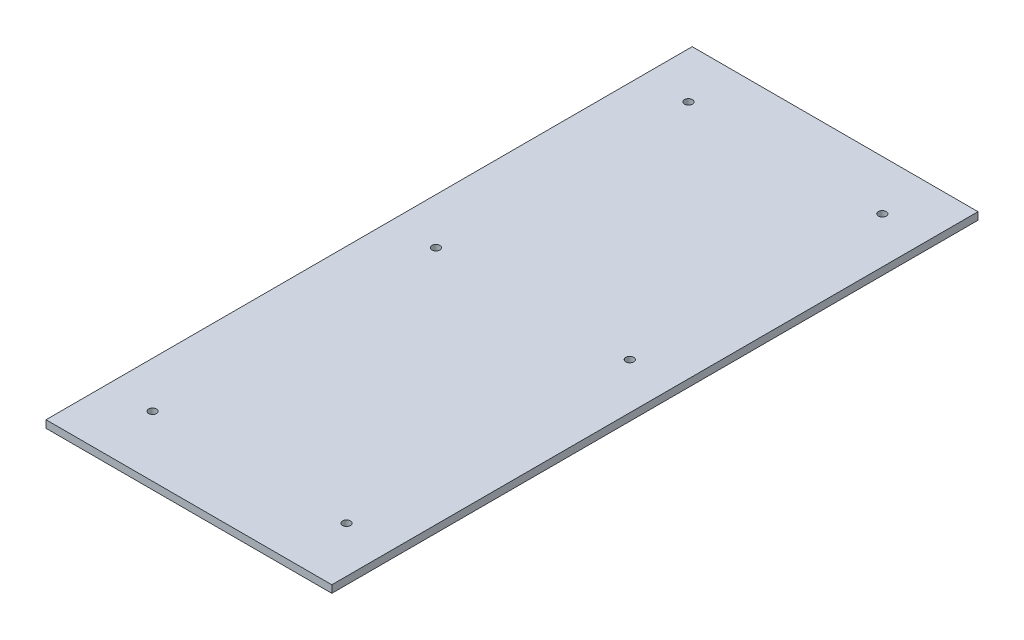
ISO-10303-21;
HEADER;
FILE_DESCRIPTION(('STEP AP214'),'2;1');
FILE_NAME('part.step','',(''),(''),'','','');
FILE_SCHEMA(('AUTOMOTIVE_DESIGN { 1 0 10303 214 1 1 1 1 }'));
ENDSEC;
DATA;
#1=APPLICATION_CONTEXT('core data for automotive mechanical design processes');
#2=APPLICATION_PROTOCOL_DEFINITION('international standard','automotive_design',2000,#1);
#3=PRODUCT_CONTEXT('',#1,'mechanical');
#4=PRODUCT('Part','Part','',(#3));
#5=PRODUCT_RELATED_PRODUCT_CATEGORY('part','',(#4));
#6=PRODUCT_DEFINITION_FORMATION('','',#4);
#7=PRODUCT_DEFINITION_CONTEXT('part definition',#1,'design');
#8=PRODUCT_DEFINITION('design','',#6,#7);
#9=PRODUCT_DEFINITION_SHAPE('','',#8);
#10=(LENGTH_UNIT() NAMED_UNIT(*) SI_UNIT(.MILLI.,.METRE.));
#11=(NAMED_UNIT(*) PLANE_ANGLE_UNIT() SI_UNIT($,.RADIAN.));
#12=(NAMED_UNIT(*) SI_UNIT($,.STERADIAN.) SOLID_ANGLE_UNIT());
#13=UNCERTAINTY_MEASURE_WITH_UNIT(LENGTH_MEASURE(1.E-05),#10,'distance_accuracy_value','');
#14=(GEOMETRIC_REPRESENTATION_CONTEXT(3) GLOBAL_UNCERTAINTY_ASSIGNED_CONTEXT((#13)) GLOBAL_UNIT_ASSIGNED_CONTEXT((#10,
#11,#12)) REPRESENTATION_CONTEXT('',''));
#15=CARTESIAN_POINT('',(0.,0.,0.));
#16=DIRECTION('',(0.,0.,1.));
#17=DIRECTION('',(1.,0.,0.));
#18=AXIS2_PLACEMENT_3D('',#15,#16,#17);
#19=CARTESIAN_POINT('',(-34.9254791999666,3.,-37.0612099424105));
#20=DIRECTION('',(1.,0.,0.));
#21=DIRECTION('',(0.,0.,-1.));
#22=AXIS2_PLACEMENT_3D('',#19,#20,#21);
#23=PLANE('',#22);
#24=DIRECTION('',(0.,0.,1.));
#25=VECTOR('',#24,1.);
#26=CARTESIAN_POINT('',(-34.9254791999666,0.,-37.0612099424105));
#27=LINE('',#26,#25);
#28=CARTESIAN_POINT('',(-34.9254791999666,0.,-37.0612099424105));
#29=VERTEX_POINT('',#28);
#30=CARTESIAN_POINT('',(-34.9254791999665,0.,222.93879005759));
#31=VERTEX_POINT('',#30);
#32=EDGE_CURVE('E96',#29,#31,#27,.T.);
#33=ORIENTED_EDGE('',*,*,#32,.T.);
#34=DIRECTION('',(0.,-1.,0.));
#35=VECTOR('',#34,1.);
#36=CARTESIAN_POINT('',(-34.9254791999665,3.,222.93879005759));
#37=LINE('',#36,#35);
#38=CARTESIAN_POINT('',(-34.9254791999665,3.,222.93879005759));
#39=VERTEX_POINT('',#38);
#40=EDGE_CURVE('E11',#39,#31,#37,.T.);
#41=ORIENTED_EDGE('',*,*,#40,.F.);
#42=DIRECTION('',(0.,0.,1.));
#43=VECTOR('',#42,1.);
#44=CARTESIAN_POINT('',(-34.9254791999666,3.,-37.0612099424105));
#45=LINE('',#44,#43);
#46=CARTESIAN_POINT('',(-34.9254791999666,3.,-37.0612099424105));
#47=VERTEX_POINT('',#46);
#48=EDGE_CURVE('E82',#47,#39,#45,.T.);
#49=ORIENTED_EDGE('',*,*,#48,.F.);
#50=DIRECTION('',(0.,-1.,0.));
#51=VECTOR('',#50,1.);
#52=CARTESIAN_POINT('',(-34.9254791999666,3.,-37.0612099424105));
#53=LINE('',#52,#51);
#54=EDGE_CURVE('E49',#47,#29,#53,.T.);
#55=ORIENTED_EDGE('',*,*,#54,.T.);
#56=EDGE_LOOP('',(#33,#41,#49,#55));
#57=FACE_BOUND('',#56,.T.);
#58=ADVANCED_FACE('F33',(#57),#23,.F.);
#59=CARTESIAN_POINT('',(-34.9254791999665,3.,222.93879005759));
#60=DIRECTION('',(0.,0.,-1.));
#61=DIRECTION('',(-1.,0.,0.));
#62=AXIS2_PLACEMENT_3D('',#59,#60,#61);
#63=PLANE('',#62);
#64=DIRECTION('',(1.,0.,0.));
#65=VECTOR('',#64,1.);
#66=CARTESIAN_POINT('',(-34.9254791999665,0.,222.93879005759));
#67=LINE('',#66,#65);
#68=CARTESIAN_POINT('',(80.0745208000335,0.,222.93879005759));
#69=VERTEX_POINT('',#68);
#70=EDGE_CURVE('E87',#31,#69,#67,.T.);
#71=ORIENTED_EDGE('',*,*,#70,.T.);
#72=DIRECTION('',(0.,-1.,0.));
#73=VECTOR('',#72,1.);
#74=CARTESIAN_POINT('',(80.0745208000335,3.,222.93879005759));
#75=LINE('',#74,#73);
#76=CARTESIAN_POINT('',(80.0745208000335,3.,222.93879005759));
#77=VERTEX_POINT('',#76);
#78=EDGE_CURVE('E41',#77,#69,#75,.T.);
#79=ORIENTED_EDGE('',*,*,#78,.F.);
#80=DIRECTION('',(1.,0.,0.));
#81=VECTOR('',#80,1.);
#82=CARTESIAN_POINT('',(-34.9254791999665,3.,222.93879005759));
#83=LINE('',#82,#81);
#84=EDGE_CURVE('E74',#39,#77,#83,.T.);
#85=ORIENTED_EDGE('',*,*,#84,.F.);
#86=ORIENTED_EDGE('',*,*,#40,.T.);
#87=EDGE_LOOP('',(#71,#79,#85,#86));
#88=FACE_BOUND('',#87,.T.);
#89=ADVANCED_FACE('F86',(#88),#63,.F.);
#90=CARTESIAN_POINT('',(80.0745208000334,3.,-37.0612099424105));
#91=DIRECTION('',(1.,0.,0.));
#92=DIRECTION('',(0.,0.,-1.));
#93=AXIS2_PLACEMENT_3D('',#90,#91,#92);
#94=PLANE('',#93);
#95=DIRECTION('',(0.,0.,1.));
#96=VECTOR('',#95,1.);
#97=CARTESIAN_POINT('',(80.0745208000334,0.,-37.0612099424105));
#98=LINE('',#97,#96);
#99=CARTESIAN_POINT('',(80.0745208000334,0.,-37.0612099424105));
#100=VERTEX_POINT('',#99);
#101=EDGE_CURVE('E100',#100,#69,#98,.T.);
#102=ORIENTED_EDGE('',*,*,#101,.F.);
#103=DIRECTION('',(0.,-1.,0.));
#104=VECTOR('',#103,1.);
#105=CARTESIAN_POINT('',(80.0745208000334,3.,-37.0612099424105));
#106=LINE('',#105,#104);
#107=CARTESIAN_POINT('',(80.0745208000334,3.,-37.0612099424105));
#108=VERTEX_POINT('',#107);
#109=EDGE_CURVE('E63',#108,#100,#106,.T.);
#110=ORIENTED_EDGE('',*,*,#109,.F.);
#111=DIRECTION('',(0.,0.,1.));
#112=VECTOR('',#111,1.);
#113=CARTESIAN_POINT('',(80.0745208000334,3.,-37.0612099424105));
#114=LINE('',#113,#112);
#115=EDGE_CURVE('E81',#108,#77,#114,.T.);
#116=ORIENTED_EDGE('',*,*,#115,.T.);
#117=ORIENTED_EDGE('',*,*,#78,.T.);
#118=EDGE_LOOP('',(#102,#110,#116,#117));
#119=FACE_BOUND('',#118,.T.);
#120=ADVANCED_FACE('F90',(#119),#94,.T.);
#121=CARTESIAN_POINT('',(-34.9254791999666,3.,-37.0612099424105));
#122=DIRECTION('',(0.,0.,-1.));
#123=DIRECTION('',(-1.,0.,0.));
#124=AXIS2_PLACEMENT_3D('',#121,#122,#123);
#125=PLANE('',#124);
#126=DIRECTION('',(1.,0.,0.));
#127=VECTOR('',#126,1.);
#128=CARTESIAN_POINT('',(-34.9254791999666,0.,-37.0612099424105));
#129=LINE('',#128,#127);
#130=EDGE_CURVE('E102',#29,#100,#129,.T.);
#131=ORIENTED_EDGE('',*,*,#130,.F.);
#132=ORIENTED_EDGE('',*,*,#54,.F.);
#133=DIRECTION('',(1.,0.,0.));
#134=VECTOR('',#133,1.);
#135=CARTESIAN_POINT('',(-34.9254791999666,3.,-37.0612099424105));
#136=LINE('',#135,#134);
#137=EDGE_CURVE('E91',#47,#108,#136,.T.);
#138=ORIENTED_EDGE('',*,*,#137,.T.);
#139=ORIENTED_EDGE('',*,*,#109,.T.);
#140=EDGE_LOOP('',(#131,#132,#138,#139));
#141=FACE_BOUND('',#140,.T.);
#142=ADVANCED_FACE('F150',(#141),#125,.T.);
#143=CARTESIAN_POINT('',(0.,3.,0.));
#144=DIRECTION('',(0.,1.,0.));
#145=DIRECTION('',(0.,0.,1.));
#146=AXIS2_PLACEMENT_3D('',#143,#144,#145);
#147=PLANE('',#146);
#148=CARTESIAN_POINT('',(61.5745208000334,3.,-17.0612099424105));
#149=DIRECTION('',(0.,1.,0.));
#150=DIRECTION('',(0.,0.,1.));
#151=AXIS2_PLACEMENT_3D('',#148,#149,#150);
#152=CIRCLE('',#151,1.6);
#153=CARTESIAN_POINT('',(61.5745208000334,3.,-15.4612099424105));
#154=VERTEX_POINT('',#153);
#155=EDGE_CURVE('E140',#154,#154,#152,.T.);
#156=ORIENTED_EDGE('',*,*,#155,.F.);
#157=EDGE_LOOP('',(#156));
#158=FACE_BOUND('',#157,.T.);
#159=CARTESIAN_POINT('',(-16.4254791999666,3.,-17.0612099424105));
#160=DIRECTION('',(0.,1.,0.));
#161=DIRECTION('',(0.,0.,1.));
#162=AXIS2_PLACEMENT_3D('',#159,#160,#161);
#163=CIRCLE('',#162,1.6);
#164=CARTESIAN_POINT('',(-16.4254791999666,3.,-15.4612099424105));
#165=VERTEX_POINT('',#164);
#166=EDGE_CURVE('E134',#165,#165,#163,.T.);
#167=ORIENTED_EDGE('',*,*,#166,.F.);
#168=EDGE_LOOP('',(#167));
#169=FACE_BOUND('',#168,.T.);
#170=CARTESIAN_POINT('',(61.5745208000334,3.,84.5387900575895));
#171=DIRECTION('',(0.,1.,0.));
#172=DIRECTION('',(0.,0.,1.));
#173=AXIS2_PLACEMENT_3D('',#170,#171,#172);
#174=CIRCLE('',#173,1.60000000000001);
#175=CARTESIAN_POINT('',(61.5745208000334,3.,86.1387900575895));
#176=VERTEX_POINT('',#175);
#177=EDGE_CURVE('E128',#176,#176,#174,.T.);
#178=ORIENTED_EDGE('',*,*,#177,.F.);
#179=EDGE_LOOP('',(#178));
#180=FACE_BOUND('',#179,.T.);
#181=CARTESIAN_POINT('',(-16.4254791999666,3.,84.5387900575895));
#182=DIRECTION('',(0.,1.,0.));
#183=DIRECTION('',(0.,0.,1.));
#184=AXIS2_PLACEMENT_3D('',#181,#182,#183);
#185=CIRCLE('',#184,1.6);
#186=CARTESIAN_POINT('',(-16.4254791999666,3.,86.1387900575895));
#187=VERTEX_POINT('',#186);
#188=EDGE_CURVE('E122',#187,#187,#185,.T.);
#189=ORIENTED_EDGE('',*,*,#188,.F.);
#190=EDGE_LOOP('',(#189));
#191=FACE_BOUND('',#190,.T.);
#192=CARTESIAN_POINT('',(61.5745208000334,3.,198.538790057589));
#193=DIRECTION('',(0.,1.,0.));
#194=DIRECTION('',(0.,0.,1.));
#195=AXIS2_PLACEMENT_3D('',#192,#193,#194);
#196=CIRCLE('',#195,1.6);
#197=CARTESIAN_POINT('',(61.5745208000334,3.,200.138790057589));
#198=VERTEX_POINT('',#197);
#199=EDGE_CURVE('E116',#198,#198,#196,.T.);
#200=ORIENTED_EDGE('',*,*,#199,.F.);
#201=EDGE_LOOP('',(#200));
#202=FACE_BOUND('',#201,.T.);
#203=CARTESIAN_POINT('',(-16.4254791999666,3.,198.53879005759));
#204=DIRECTION('',(0.,1.,0.));
#205=DIRECTION('',(0.,0.,1.));
#206=AXIS2_PLACEMENT_3D('',#203,#204,#205);
#207=CIRCLE('',#206,1.6);
#208=CARTESIAN_POINT('',(-16.4254791999666,3.,200.138790057589));
#209=VERTEX_POINT('',#208);
#210=EDGE_CURVE('E110',#209,#209,#207,.T.);
#211=ORIENTED_EDGE('',*,*,#210,.F.);
#212=EDGE_LOOP('',(#211));
#213=FACE_BOUND('',#212,.T.);
#214=ORIENTED_EDGE('',*,*,#48,.T.);
#215=ORIENTED_EDGE('',*,*,#84,.T.);
#216=ORIENTED_EDGE('',*,*,#115,.F.);
#217=ORIENTED_EDGE('',*,*,#137,.F.);
#218=EDGE_LOOP('',(#214,#215,#216,#217));
#219=FACE_BOUND('',#218,.T.);
#220=ADVANCED_FACE('F78',(#158,#169,#180,#191,#202,#213,#219),#147,.T.);
#221=CARTESIAN_POINT('',(0.,0.,0.));
#222=DIRECTION('',(0.,1.,0.));
#223=DIRECTION('',(0.,0.,1.));
#224=AXIS2_PLACEMENT_3D('',#221,#222,#223);
#225=PLANE('',#224);
#226=CARTESIAN_POINT('',(61.5745208000334,0.,-17.0612099424105));
#227=DIRECTION('',(0.,1.,0.));
#228=DIRECTION('',(0.,0.,1.));
#229=AXIS2_PLACEMENT_3D('',#226,#227,#228);
#230=CIRCLE('',#229,1.6);
#231=CARTESIAN_POINT('',(61.5745208000334,0.,-15.4612099424105));
#232=VERTEX_POINT('',#231);
#233=EDGE_CURVE('E137',#232,#232,#230,.F.);
#234=ORIENTED_EDGE('',*,*,#233,.F.);
#235=EDGE_LOOP('',(#234));
#236=FACE_BOUND('',#235,.T.);
#237=CARTESIAN_POINT('',(-16.4254791999666,0.,-17.0612099424105));
#238=DIRECTION('',(0.,1.,0.));
#239=DIRECTION('',(0.,0.,1.));
#240=AXIS2_PLACEMENT_3D('',#237,#238,#239);
#241=CIRCLE('',#240,1.6);
#242=CARTESIAN_POINT('',(-16.4254791999666,0.,-15.4612099424105));
#243=VERTEX_POINT('',#242);
#244=EDGE_CURVE('E131',#243,#243,#241,.F.);
#245=ORIENTED_EDGE('',*,*,#244,.F.);
#246=EDGE_LOOP('',(#245));
#247=FACE_BOUND('',#246,.T.);
#248=CARTESIAN_POINT('',(61.5745208000334,0.,84.5387900575895));
#249=DIRECTION('',(0.,1.,0.));
#250=DIRECTION('',(0.,0.,1.));
#251=AXIS2_PLACEMENT_3D('',#248,#249,#250);
#252=CIRCLE('',#251,1.60000000000001);
#253=CARTESIAN_POINT('',(61.5745208000334,0.,86.1387900575895));
#254=VERTEX_POINT('',#253);
#255=EDGE_CURVE('E125',#254,#254,#252,.F.);
#256=ORIENTED_EDGE('',*,*,#255,.F.);
#257=EDGE_LOOP('',(#256));
#258=FACE_BOUND('',#257,.T.);
#259=CARTESIAN_POINT('',(-16.4254791999666,0.,84.5387900575895));
#260=DIRECTION('',(0.,1.,0.));
#261=DIRECTION('',(0.,0.,1.));
#262=AXIS2_PLACEMENT_3D('',#259,#260,#261);
#263=CIRCLE('',#262,1.6);
#264=CARTESIAN_POINT('',(-16.4254791999666,0.,86.1387900575895));
#265=VERTEX_POINT('',#264);
#266=EDGE_CURVE('E119',#265,#265,#263,.F.);
#267=ORIENTED_EDGE('',*,*,#266,.F.);
#268=EDGE_LOOP('',(#267));
#269=FACE_BOUND('',#268,.T.);
#270=CARTESIAN_POINT('',(61.5745208000334,0.,198.538790057589));
#271=DIRECTION('',(0.,1.,0.));
#272=DIRECTION('',(0.,0.,1.));
#273=AXIS2_PLACEMENT_3D('',#270,#271,#272);
#274=CIRCLE('',#273,1.6);
#275=CARTESIAN_POINT('',(61.5745208000334,0.,200.138790057589));
#276=VERTEX_POINT('',#275);
#277=EDGE_CURVE('E113',#276,#276,#274,.F.);
#278=ORIENTED_EDGE('',*,*,#277,.F.);
#279=EDGE_LOOP('',(#278));
#280=FACE_BOUND('',#279,.T.);
#281=CARTESIAN_POINT('',(-16.4254791999666,0.,198.53879005759));
#282=DIRECTION('',(0.,1.,0.));
#283=DIRECTION('',(0.,0.,1.));
#284=AXIS2_PLACEMENT_3D('',#281,#282,#283);
#285=CIRCLE('',#284,1.6);
#286=CARTESIAN_POINT('',(-16.4254791999666,0.,200.138790057589));
#287=VERTEX_POINT('',#286);
#288=EDGE_CURVE('E98',#287,#287,#285,.F.);
#289=ORIENTED_EDGE('',*,*,#288,.F.);
#290=EDGE_LOOP('',(#289));
#291=FACE_BOUND('',#290,.T.);
#292=ORIENTED_EDGE('',*,*,#32,.F.);
#293=ORIENTED_EDGE('',*,*,#130,.T.);
#294=ORIENTED_EDGE('',*,*,#101,.T.);
#295=ORIENTED_EDGE('',*,*,#70,.F.);
#296=EDGE_LOOP('',(#292,#293,#294,#295));
#297=FACE_BOUND('',#296,.T.);
#298=ADVANCED_FACE('F149',(#236,#247,#258,#269,#280,#291,#297),#225,.F.);
#299=CARTESIAN_POINT('',(-16.4254791999666,-0.00100000000000013,198.53879005759));
#300=DIRECTION('',(0.,1.,0.));
#301=DIRECTION('',(0.,0.,1.));
#302=AXIS2_PLACEMENT_3D('',#299,#300,#301);
#303=CYLINDRICAL_SURFACE('',#302,1.6);
#304=CARTESIAN_POINT('',(-16.4254791999666,3.,200.138790057589));
#305=CARTESIAN_POINT('',(-16.4254791999666,2.96875,200.138790057589));
#306=CARTESIAN_POINT('',(-16.4254791999666,2.9375,200.138790057589));
#307=CARTESIAN_POINT('',(-16.4254791999666,2.875,200.138790057589));
#308=CARTESIAN_POINT('',(-16.4254791999666,2.84375,200.138790057589));
#309=CARTESIAN_POINT('',(-16.4254791999666,2.78125,200.138790057589));
#310=CARTESIAN_POINT('',(-16.4254791999666,2.75,200.138790057589));
#311=CARTESIAN_POINT('',(-16.4254791999666,2.6875,200.138790057589));
#312=CARTESIAN_POINT('',(-16.4254791999666,2.65625,200.138790057589));
#313=CARTESIAN_POINT('',(-16.4254791999666,2.59375,200.138790057589));
#314=CARTESIAN_POINT('',(-16.4254791999666,2.5625,200.138790057589));
#315=CARTESIAN_POINT('',(-16.4254791999666,2.5,200.138790057589));
#316=CARTESIAN_POINT('',(-16.4254791999666,2.46875,200.138790057589));
#317=CARTESIAN_POINT('',(-16.4254791999666,2.40625,200.138790057589));
#318=CARTESIAN_POINT('',(-16.4254791999666,2.375,200.138790057589));
#319=CARTESIAN_POINT('',(-16.4254791999666,2.3125,200.138790057589));
#320=CARTESIAN_POINT('',(-16.4254791999666,2.28125,200.138790057589));
#321=CARTESIAN_POINT('',(-16.4254791999666,2.21875,200.138790057589));
#322=CARTESIAN_POINT('',(-16.4254791999666,2.1875,200.138790057589));
#323=CARTESIAN_POINT('',(-16.4254791999666,2.125,200.138790057589));
#324=CARTESIAN_POINT('',(-16.4254791999666,2.09375,200.138790057589));
#325=CARTESIAN_POINT('',(-16.4254791999666,2.03125,200.138790057589));
#326=CARTESIAN_POINT('',(-16.4254791999666,2.,200.138790057589));
#327=CARTESIAN_POINT('',(-16.4254791999666,1.9375,200.138790057589));
#328=CARTESIAN_POINT('',(-16.4254791999666,1.90625,200.138790057589));
#329=CARTESIAN_POINT('',(-16.4254791999666,1.84375,200.138790057589));
#330=CARTESIAN_POINT('',(-16.4254791999666,1.8125,200.138790057589));
#331=CARTESIAN_POINT('',(-16.4254791999666,1.75,200.138790057589));
#332=CARTESIAN_POINT('',(-16.4254791999666,1.71875,200.138790057589));
#333=CARTESIAN_POINT('',(-16.4254791999666,1.65625,200.138790057589));
#334=CARTESIAN_POINT('',(-16.4254791999666,1.625,200.138790057589));
#335=CARTESIAN_POINT('',(-16.4254791999666,1.5625,200.138790057589));
#336=CARTESIAN_POINT('',(-16.4254791999666,1.53125,200.138790057589));
#337=CARTESIAN_POINT('',(-16.4254791999666,1.46875,200.138790057589));
#338=CARTESIAN_POINT('',(-16.4254791999666,1.4375,200.138790057589));
#339=CARTESIAN_POINT('',(-16.4254791999666,1.375,200.138790057589));
#340=CARTESIAN_POINT('',(-16.4254791999666,1.34375,200.138790057589));
#341=CARTESIAN_POINT('',(-16.4254791999666,1.28125,200.138790057589));
#342=CARTESIAN_POINT('',(-16.4254791999666,1.25,200.138790057589));
#343=CARTESIAN_POINT('',(-16.4254791999666,1.1875,200.138790057589));
#344=CARTESIAN_POINT('',(-16.4254791999666,1.15625,200.138790057589));
#345=CARTESIAN_POINT('',(-16.4254791999666,1.09375,200.138790057589));
#346=CARTESIAN_POINT('',(-16.4254791999666,1.0625,200.138790057589));
#347=CARTESIAN_POINT('',(-16.4254791999666,1.,200.138790057589));
#348=CARTESIAN_POINT('',(-16.4254791999666,0.96875,200.138790057589));
#349=CARTESIAN_POINT('',(-16.4254791999666,0.90625,200.138790057589));
#350=CARTESIAN_POINT('',(-16.4254791999666,0.875,200.138790057589));
#351=CARTESIAN_POINT('',(-16.4254791999666,0.8125,200.138790057589));
#352=CARTESIAN_POINT('',(-16.4254791999666,0.78125,200.138790057589));
#353=CARTESIAN_POINT('',(-16.4254791999666,0.71875,200.138790057589));
#354=CARTESIAN_POINT('',(-16.4254791999666,0.6875,200.138790057589));
#355=CARTESIAN_POINT('',(-16.4254791999666,0.625,200.138790057589));
#356=CARTESIAN_POINT('',(-16.4254791999666,0.59375,200.138790057589));
#357=CARTESIAN_POINT('',(-16.4254791999666,0.53125,200.138790057589));
#358=CARTESIAN_POINT('',(-16.4254791999666,0.5,200.138790057589));
#359=CARTESIAN_POINT('',(-16.4254791999666,0.4375,200.138790057589));
#360=CARTESIAN_POINT('',(-16.4254791999666,0.40625,200.138790057589));
#361=CARTESIAN_POINT('',(-16.4254791999666,0.34375,200.138790057589));
#362=CARTESIAN_POINT('',(-16.4254791999666,0.3125,200.138790057589));
#363=CARTESIAN_POINT('',(-16.4254791999666,0.25,200.138790057589));
#364=CARTESIAN_POINT('',(-16.4254791999666,0.21875,200.138790057589));
#365=CARTESIAN_POINT('',(-16.4254791999666,0.15625,200.138790057589));
#366=CARTESIAN_POINT('',(-16.4254791999666,0.125,200.138790057589));
#367=CARTESIAN_POINT('',(-16.4254791999666,0.0625000000000001,200.138790057589));
#368=CARTESIAN_POINT('',(-16.4254791999666,0.0312500000000001,200.138790057589));
#369=CARTESIAN_POINT('',(-16.4254791999666,0.,200.138790057589));
#370=B_SPLINE_CURVE_WITH_KNOTS('',3,(#304,#305,#306,#307,#308,#309,#310,#311,#312,#313,#314,
#315,#316,#317,#318,#319,#320,#321,#322,#323,#324,#325,#326,#327,#328,#329,#330,#331,#332,#333,
#334,#335,#336,#337,#338,#339,#340,#341,#342,#343,#344,#345,#346,#347,#348,#349,#350,#351,#352,
#353,#354,#355,#356,#357,#358,#359,#360,#361,#362,#363,#364,#365,#366,#367,#368,#369),
.UNSPECIFIED.,.F.,.F.,(4,2,2,2,2,2,2,2,2,2,2,2,2,2,2,2,2,2,2,2,2,2,2,2,2,2,2,2,2,2,2,2,4),(0.,
0.0937500000000001,0.1875,0.28125,0.375,0.46875,0.5625,0.65625,0.75,0.84375,0.9375,1.03125,
1.125,1.21875,1.3125,1.40625,1.5,1.59375,1.6875,1.78125,1.875,1.96875,2.0625,2.15625,2.25,
2.34375,2.4375,2.53125,2.625,2.71875,2.8125,2.90625,3.),.UNSPECIFIED.);
#371=EDGE_CURVE('BSEAM162',#209,#287,#370,.T.);
#372=ORIENTED_EDGE('',*,*,#210,.T.);
#373=ORIENTED_EDGE('',*,*,#288,.T.);
#374=ORIENTED_EDGE('',*,*,#371,.T.);
#375=ORIENTED_EDGE('',*,*,#371,.F.);
#376=EDGE_LOOP('',(#372,#374,#373,#375));
#377=FACE_BOUND('',#376,.T.);
#378=ADVANCED_FACE('F162',(#377),#303,.F.);
#379=CARTESIAN_POINT('',(61.5745208000334,-0.00100000000000013,198.538790057589));
#380=DIRECTION('',(0.,1.,0.));
#381=DIRECTION('',(0.,0.,1.));
#382=AXIS2_PLACEMENT_3D('',#379,#380,#381);
#383=CYLINDRICAL_SURFACE('',#382,1.6);
#384=CARTESIAN_POINT('',(61.5745208000334,3.,200.138790057589));
#385=CARTESIAN_POINT('',(61.5745208000334,2.96875,200.138790057589));
#386=CARTESIAN_POINT('',(61.5745208000334,2.9375,200.138790057589));
#387=CARTESIAN_POINT('',(61.5745208000334,2.875,200.138790057589));
#388=CARTESIAN_POINT('',(61.5745208000334,2.84375,200.138790057589));
#389=CARTESIAN_POINT('',(61.5745208000334,2.78125,200.138790057589));
#390=CARTESIAN_POINT('',(61.5745208000334,2.75,200.138790057589));
#391=CARTESIAN_POINT('',(61.5745208000334,2.6875,200.138790057589));
#392=CARTESIAN_POINT('',(61.5745208000334,2.65625,200.138790057589));
#393=CARTESIAN_POINT('',(61.5745208000334,2.59375,200.138790057589));
#394=CARTESIAN_POINT('',(61.5745208000334,2.5625,200.138790057589));
#395=CARTESIAN_POINT('',(61.5745208000334,2.5,200.138790057589));
#396=CARTESIAN_POINT('',(61.5745208000334,2.46875,200.138790057589));
#397=CARTESIAN_POINT('',(61.5745208000334,2.40625,200.138790057589));
#398=CARTESIAN_POINT('',(61.5745208000334,2.375,200.138790057589));
#399=CARTESIAN_POINT('',(61.5745208000334,2.3125,200.138790057589));
#400=CARTESIAN_POINT('',(61.5745208000334,2.28125,200.138790057589));
#401=CARTESIAN_POINT('',(61.5745208000334,2.21875,200.138790057589));
#402=CARTESIAN_POINT('',(61.5745208000334,2.1875,200.138790057589));
#403=CARTESIAN_POINT('',(61.5745208000334,2.125,200.138790057589));
#404=CARTESIAN_POINT('',(61.5745208000334,2.09375,200.138790057589));
#405=CARTESIAN_POINT('',(61.5745208000334,2.03125,200.138790057589));
#406=CARTESIAN_POINT('',(61.5745208000334,2.,200.138790057589));
#407=CARTESIAN_POINT('',(61.5745208000334,1.9375,200.138790057589));
#408=CARTESIAN_POINT('',(61.5745208000334,1.90625,200.138790057589));
#409=CARTESIAN_POINT('',(61.5745208000334,1.84375,200.138790057589));
#410=CARTESIAN_POINT('',(61.5745208000334,1.8125,200.138790057589));
#411=CARTESIAN_POINT('',(61.5745208000334,1.75,200.138790057589));
#412=CARTESIAN_POINT('',(61.5745208000334,1.71875,200.138790057589));
#413=CARTESIAN_POINT('',(61.5745208000334,1.65625,200.138790057589));
#414=CARTESIAN_POINT('',(61.5745208000334,1.625,200.138790057589));
#415=CARTESIAN_POINT('',(61.5745208000334,1.5625,200.138790057589));
#416=CARTESIAN_POINT('',(61.5745208000334,1.53125,200.138790057589));
#417=CARTESIAN_POINT('',(61.5745208000334,1.46875,200.138790057589));
#418=CARTESIAN_POINT('',(61.5745208000334,1.4375,200.138790057589));
#419=CARTESIAN_POINT('',(61.5745208000334,1.375,200.138790057589));
#420=CARTESIAN_POINT('',(61.5745208000334,1.34375,200.138790057589));
#421=CARTESIAN_POINT('',(61.5745208000334,1.28125,200.138790057589));
#422=CARTESIAN_POINT('',(61.5745208000334,1.25,200.138790057589));
#423=CARTESIAN_POINT('',(61.5745208000334,1.1875,200.138790057589));
#424=CARTESIAN_POINT('',(61.5745208000334,1.15625,200.138790057589));
#425=CARTESIAN_POINT('',(61.5745208000334,1.09375,200.138790057589));
#426=CARTESIAN_POINT('',(61.5745208000334,1.0625,200.138790057589));
#427=CARTESIAN_POINT('',(61.5745208000334,1.,200.138790057589));
#428=CARTESIAN_POINT('',(61.5745208000334,0.96875,200.138790057589));
#429=CARTESIAN_POINT('',(61.5745208000334,0.90625,200.138790057589));
#430=CARTESIAN_POINT('',(61.5745208000334,0.875,200.138790057589));
#431=CARTESIAN_POINT('',(61.5745208000334,0.8125,200.138790057589));
#432=CARTESIAN_POINT('',(61.5745208000334,0.78125,200.138790057589));
#433=CARTESIAN_POINT('',(61.5745208000334,0.71875,200.138790057589));
#434=CARTESIAN_POINT('',(61.5745208000334,0.6875,200.138790057589));
#435=CARTESIAN_POINT('',(61.5745208000334,0.625,200.138790057589));
#436=CARTESIAN_POINT('',(61.5745208000334,0.59375,200.138790057589));
#437=CARTESIAN_POINT('',(61.5745208000334,0.53125,200.138790057589));
#438=CARTESIAN_POINT('',(61.5745208000334,0.5,200.138790057589));
#439=CARTESIAN_POINT('',(61.5745208000334,0.4375,200.138790057589));
#440=CARTESIAN_POINT('',(61.5745208000334,0.40625,200.138790057589));
#441=CARTESIAN_POINT('',(61.5745208000334,0.34375,200.138790057589));
#442=CARTESIAN_POINT('',(61.5745208000334,0.3125,200.138790057589));
#443=CARTESIAN_POINT('',(61.5745208000334,0.25,200.138790057589));
#444=CARTESIAN_POINT('',(61.5745208000334,0.21875,200.138790057589));
#445=CARTESIAN_POINT('',(61.5745208000334,0.15625,200.138790057589));
#446=CARTESIAN_POINT('',(61.5745208000334,0.125,200.138790057589));
#447=CARTESIAN_POINT('',(61.5745208000334,0.0625000000000001,200.138790057589));
#448=CARTESIAN_POINT('',(61.5745208000334,0.0312500000000001,200.138790057589));
#449=CARTESIAN_POINT('',(61.5745208000334,0.,200.138790057589));
#450=B_SPLINE_CURVE_WITH_KNOTS('',3,(#384,#385,#386,#387,#388,#389,#390,#391,#392,#393,#394,
#395,#396,#397,#398,#399,#400,#401,#402,#403,#404,#405,#406,#407,#408,#409,#410,#411,#412,#413,
#414,#415,#416,#417,#418,#419,#420,#421,#422,#423,#424,#425,#426,#427,#428,#429,#430,#431,#432,
#433,#434,#435,#436,#437,#438,#439,#440,#441,#442,#443,#444,#445,#446,#447,#448,#449),
.UNSPECIFIED.,.F.,.F.,(4,2,2,2,2,2,2,2,2,2,2,2,2,2,2,2,2,2,2,2,2,2,2,2,2,2,2,2,2,2,2,2,4),(0.,
0.0937500000000001,0.1875,0.28125,0.375,0.46875,0.5625,0.65625,0.75,0.84375,0.9375,1.03125,
1.125,1.21875,1.3125,1.40625,1.5,1.59375,1.6875,1.78125,1.875,1.96875,2.0625,2.15625,2.25,
2.34375,2.4375,2.53125,2.625,2.71875,2.8125,2.90625,3.),.UNSPECIFIED.);
#451=EDGE_CURVE('BSEAM165',#198,#276,#450,.T.);
#452=ORIENTED_EDGE('',*,*,#199,.T.);
#453=ORIENTED_EDGE('',*,*,#277,.T.);
#454=ORIENTED_EDGE('',*,*,#451,.T.);
#455=ORIENTED_EDGE('',*,*,#451,.F.);
#456=EDGE_LOOP('',(#452,#454,#453,#455));
#457=FACE_BOUND('',#456,.T.);
#458=ADVANCED_FACE('F165',(#457),#383,.F.);
#459=CARTESIAN_POINT('',(-16.4254791999666,-0.00100000000000013,84.5387900575895));
#460=DIRECTION('',(0.,1.,0.));
#461=DIRECTION('',(0.,0.,1.));
#462=AXIS2_PLACEMENT_3D('',#459,#460,#461);
#463=CYLINDRICAL_SURFACE('',#462,1.6);
#464=CARTESIAN_POINT('',(-16.4254791999666,3.,86.1387900575895));
#465=CARTESIAN_POINT('',(-16.4254791999666,2.96875,86.1387900575895));
#466=CARTESIAN_POINT('',(-16.4254791999666,2.9375,86.1387900575895));
#467=CARTESIAN_POINT('',(-16.4254791999666,2.875,86.1387900575895));
#468=CARTESIAN_POINT('',(-16.4254791999666,2.84375,86.1387900575895));
#469=CARTESIAN_POINT('',(-16.4254791999666,2.78125,86.1387900575895));
#470=CARTESIAN_POINT('',(-16.4254791999666,2.75,86.1387900575895));
#471=CARTESIAN_POINT('',(-16.4254791999666,2.6875,86.1387900575895));
#472=CARTESIAN_POINT('',(-16.4254791999666,2.65625,86.1387900575895));
#473=CARTESIAN_POINT('',(-16.4254791999666,2.59375,86.1387900575895));
#474=CARTESIAN_POINT('',(-16.4254791999666,2.5625,86.1387900575895));
#475=CARTESIAN_POINT('',(-16.4254791999666,2.5,86.1387900575895));
#476=CARTESIAN_POINT('',(-16.4254791999666,2.46875,86.1387900575895));
#477=CARTESIAN_POINT('',(-16.4254791999666,2.40625,86.1387900575895));
#478=CARTESIAN_POINT('',(-16.4254791999666,2.375,86.1387900575895));
#479=CARTESIAN_POINT('',(-16.4254791999666,2.3125,86.1387900575895));
#480=CARTESIAN_POINT('',(-16.4254791999666,2.28125,86.1387900575895));
#481=CARTESIAN_POINT('',(-16.4254791999666,2.21875,86.1387900575895));
#482=CARTESIAN_POINT('',(-16.4254791999666,2.1875,86.1387900575895));
#483=CARTESIAN_POINT('',(-16.4254791999666,2.125,86.1387900575895));
#484=CARTESIAN_POINT('',(-16.4254791999666,2.09375,86.1387900575895));
#485=CARTESIAN_POINT('',(-16.4254791999666,2.03125,86.1387900575895));
#486=CARTESIAN_POINT('',(-16.4254791999666,2.,86.1387900575895));
#487=CARTESIAN_POINT('',(-16.4254791999666,1.9375,86.1387900575895));
#488=CARTESIAN_POINT('',(-16.4254791999666,1.90625,86.1387900575895));
#489=CARTESIAN_POINT('',(-16.4254791999666,1.84375,86.1387900575895));
#490=CARTESIAN_POINT('',(-16.4254791999666,1.8125,86.1387900575895));
#491=CARTESIAN_POINT('',(-16.4254791999666,1.75,86.1387900575895));
#492=CARTESIAN_POINT('',(-16.4254791999666,1.71875,86.1387900575895));
#493=CARTESIAN_POINT('',(-16.4254791999666,1.65625,86.1387900575895));
#494=CARTESIAN_POINT('',(-16.4254791999666,1.625,86.1387900575895));
#495=CARTESIAN_POINT('',(-16.4254791999666,1.5625,86.1387900575895));
#496=CARTESIAN_POINT('',(-16.4254791999666,1.53125,86.1387900575895));
#497=CARTESIAN_POINT('',(-16.4254791999666,1.46875,86.1387900575895));
#498=CARTESIAN_POINT('',(-16.4254791999666,1.4375,86.1387900575895));
#499=CARTESIAN_POINT('',(-16.4254791999666,1.375,86.1387900575895));
#500=CARTESIAN_POINT('',(-16.4254791999666,1.34375,86.1387900575895));
#501=CARTESIAN_POINT('',(-16.4254791999666,1.28125,86.1387900575895));
#502=CARTESIAN_POINT('',(-16.4254791999666,1.25,86.1387900575895));
#503=CARTESIAN_POINT('',(-16.4254791999666,1.1875,86.1387900575895));
#504=CARTESIAN_POINT('',(-16.4254791999666,1.15625,86.1387900575895));
#505=CARTESIAN_POINT('',(-16.4254791999666,1.09375,86.1387900575895));
#506=CARTESIAN_POINT('',(-16.4254791999666,1.0625,86.1387900575895));
#507=CARTESIAN_POINT('',(-16.4254791999666,1.,86.1387900575895));
#508=CARTESIAN_POINT('',(-16.4254791999666,0.96875,86.1387900575895));
#509=CARTESIAN_POINT('',(-16.4254791999666,0.90625,86.1387900575895));
#510=CARTESIAN_POINT('',(-16.4254791999666,0.875,86.1387900575895));
#511=CARTESIAN_POINT('',(-16.4254791999666,0.8125,86.1387900575895));
#512=CARTESIAN_POINT('',(-16.4254791999666,0.78125,86.1387900575895));
#513=CARTESIAN_POINT('',(-16.4254791999666,0.71875,86.1387900575895));
#514=CARTESIAN_POINT('',(-16.4254791999666,0.6875,86.1387900575895));
#515=CARTESIAN_POINT('',(-16.4254791999666,0.625,86.1387900575895));
#516=CARTESIAN_POINT('',(-16.4254791999666,0.59375,86.1387900575895));
#517=CARTESIAN_POINT('',(-16.4254791999666,0.53125,86.1387900575895));
#518=CARTESIAN_POINT('',(-16.4254791999666,0.5,86.1387900575895));
#519=CARTESIAN_POINT('',(-16.4254791999666,0.4375,86.1387900575895));
#520=CARTESIAN_POINT('',(-16.4254791999666,0.40625,86.1387900575895));
#521=CARTESIAN_POINT('',(-16.4254791999666,0.34375,86.1387900575895));
#522=CARTESIAN_POINT('',(-16.4254791999666,0.3125,86.1387900575895));
#523=CARTESIAN_POINT('',(-16.4254791999666,0.25,86.1387900575895));
#524=CARTESIAN_POINT('',(-16.4254791999666,0.21875,86.1387900575895));
#525=CARTESIAN_POINT('',(-16.4254791999666,0.15625,86.1387900575895));
#526=CARTESIAN_POINT('',(-16.4254791999666,0.125,86.1387900575895));
#527=CARTESIAN_POINT('',(-16.4254791999666,0.0625000000000001,86.1387900575895));
#528=CARTESIAN_POINT('',(-16.4254791999666,0.0312500000000001,86.1387900575895));
#529=CARTESIAN_POINT('',(-16.4254791999666,0.,86.1387900575895));
#530=B_SPLINE_CURVE_WITH_KNOTS('',3,(#464,#465,#466,#467,#468,#469,#470,#471,#472,#473,#474,
#475,#476,#477,#478,#479,#480,#481,#482,#483,#484,#485,#486,#487,#488,#489,#490,#491,#492,#493,
#494,#495,#496,#497,#498,#499,#500,#501,#502,#503,#504,#505,#506,#507,#508,#509,#510,#511,#512,
#513,#514,#515,#516,#517,#518,#519,#520,#521,#522,#523,#524,#525,#526,#527,#528,#529),
.UNSPECIFIED.,.F.,.F.,(4,2,2,2,2,2,2,2,2,2,2,2,2,2,2,2,2,2,2,2,2,2,2,2,2,2,2,2,2,2,2,2,4),(0.,
0.0937500000000001,0.1875,0.28125,0.375,0.46875,0.5625,0.65625,0.75,0.84375,0.9375,1.03125,
1.125,1.21875,1.3125,1.40625,1.5,1.59375,1.6875,1.78125,1.875,1.96875,2.0625,2.15625,2.25,
2.34375,2.4375,2.53125,2.625,2.71875,2.8125,2.90625,3.),.UNSPECIFIED.);
#531=EDGE_CURVE('BSEAM219',#187,#265,#530,.T.);
#532=ORIENTED_EDGE('',*,*,#188,.T.);
#533=ORIENTED_EDGE('',*,*,#266,.T.);
#534=ORIENTED_EDGE('',*,*,#531,.T.);
#535=ORIENTED_EDGE('',*,*,#531,.F.);
#536=EDGE_LOOP('',(#532,#534,#533,#535));
#537=FACE_BOUND('',#536,.T.);
#538=ADVANCED_FACE('F219',(#537),#463,.F.);
#539=CARTESIAN_POINT('',(61.5745208000334,-0.00100000000000013,84.5387900575895));
#540=DIRECTION('',(0.,1.,0.));
#541=DIRECTION('',(0.,0.,1.));
#542=AXIS2_PLACEMENT_3D('',#539,#540,#541);
#543=CYLINDRICAL_SURFACE('',#542,1.60000000000001);
#544=CARTESIAN_POINT('',(61.5745208000334,3.,86.1387900575895));
#545=CARTESIAN_POINT('',(61.5745208000334,2.96875,86.1387900575895));
#546=CARTESIAN_POINT('',(61.5745208000334,2.9375,86.1387900575895));
#547=CARTESIAN_POINT('',(61.5745208000334,2.875,86.1387900575895));
#548=CARTESIAN_POINT('',(61.5745208000334,2.84375,86.1387900575895));
#549=CARTESIAN_POINT('',(61.5745208000334,2.78125,86.1387900575895));
#550=CARTESIAN_POINT('',(61.5745208000334,2.75,86.1387900575895));
#551=CARTESIAN_POINT('',(61.5745208000334,2.6875,86.1387900575895));
#552=CARTESIAN_POINT('',(61.5745208000334,2.65625,86.1387900575895));
#553=CARTESIAN_POINT('',(61.5745208000334,2.59375,86.1387900575895));
#554=CARTESIAN_POINT('',(61.5745208000334,2.5625,86.1387900575895));
#555=CARTESIAN_POINT('',(61.5745208000334,2.5,86.1387900575895));
#556=CARTESIAN_POINT('',(61.5745208000334,2.46875,86.1387900575895));
#557=CARTESIAN_POINT('',(61.5745208000334,2.40625,86.1387900575895));
#558=CARTESIAN_POINT('',(61.5745208000334,2.375,86.1387900575895));
#559=CARTESIAN_POINT('',(61.5745208000334,2.3125,86.1387900575895));
#560=CARTESIAN_POINT('',(61.5745208000334,2.28125,86.1387900575895));
#561=CARTESIAN_POINT('',(61.5745208000334,2.21875,86.1387900575895));
#562=CARTESIAN_POINT('',(61.5745208000334,2.1875,86.1387900575895));
#563=CARTESIAN_POINT('',(61.5745208000334,2.125,86.1387900575895));
#564=CARTESIAN_POINT('',(61.5745208000334,2.09375,86.1387900575895));
#565=CARTESIAN_POINT('',(61.5745208000334,2.03125,86.1387900575895));
#566=CARTESIAN_POINT('',(61.5745208000334,2.,86.1387900575895));
#567=CARTESIAN_POINT('',(61.5745208000334,1.9375,86.1387900575895));
#568=CARTESIAN_POINT('',(61.5745208000334,1.90625,86.1387900575895));
#569=CARTESIAN_POINT('',(61.5745208000334,1.84375,86.1387900575895));
#570=CARTESIAN_POINT('',(61.5745208000334,1.8125,86.1387900575895));
#571=CARTESIAN_POINT('',(61.5745208000334,1.75,86.1387900575895));
#572=CARTESIAN_POINT('',(61.5745208000334,1.71875,86.1387900575895));
#573=CARTESIAN_POINT('',(61.5745208000334,1.65625,86.1387900575895));
#574=CARTESIAN_POINT('',(61.5745208000334,1.625,86.1387900575895));
#575=CARTESIAN_POINT('',(61.5745208000334,1.5625,86.1387900575895));
#576=CARTESIAN_POINT('',(61.5745208000334,1.53125,86.1387900575895));
#577=CARTESIAN_POINT('',(61.5745208000334,1.46875,86.1387900575895));
#578=CARTESIAN_POINT('',(61.5745208000334,1.4375,86.1387900575895));
#579=CARTESIAN_POINT('',(61.5745208000334,1.375,86.1387900575895));
#580=CARTESIAN_POINT('',(61.5745208000334,1.34375,86.1387900575895));
#581=CARTESIAN_POINT('',(61.5745208000334,1.28125,86.1387900575895));
#582=CARTESIAN_POINT('',(61.5745208000334,1.25,86.1387900575895));
#583=CARTESIAN_POINT('',(61.5745208000334,1.1875,86.1387900575895));
#584=CARTESIAN_POINT('',(61.5745208000334,1.15625,86.1387900575895));
#585=CARTESIAN_POINT('',(61.5745208000334,1.09375,86.1387900575895));
#586=CARTESIAN_POINT('',(61.5745208000334,1.0625,86.1387900575895));
#587=CARTESIAN_POINT('',(61.5745208000334,1.,86.1387900575895));
#588=CARTESIAN_POINT('',(61.5745208000334,0.96875,86.1387900575895));
#589=CARTESIAN_POINT('',(61.5745208000334,0.90625,86.1387900575895));
#590=CARTESIAN_POINT('',(61.5745208000334,0.875,86.1387900575895));
#591=CARTESIAN_POINT('',(61.5745208000334,0.8125,86.1387900575895));
#592=CARTESIAN_POINT('',(61.5745208000334,0.78125,86.1387900575895));
#593=CARTESIAN_POINT('',(61.5745208000334,0.71875,86.1387900575895));
#594=CARTESIAN_POINT('',(61.5745208000334,0.6875,86.1387900575895));
#595=CARTESIAN_POINT('',(61.5745208000334,0.625,86.1387900575895));
#596=CARTESIAN_POINT('',(61.5745208000334,0.59375,86.1387900575895));
#597=CARTESIAN_POINT('',(61.5745208000334,0.53125,86.1387900575895));
#598=CARTESIAN_POINT('',(61.5745208000334,0.5,86.1387900575895));
#599=CARTESIAN_POINT('',(61.5745208000334,0.4375,86.1387900575895));
#600=CARTESIAN_POINT('',(61.5745208000334,0.40625,86.1387900575895));
#601=CARTESIAN_POINT('',(61.5745208000334,0.34375,86.1387900575895));
#602=CARTESIAN_POINT('',(61.5745208000334,0.3125,86.1387900575895));
#603=CARTESIAN_POINT('',(61.5745208000334,0.25,86.1387900575895));
#604=CARTESIAN_POINT('',(61.5745208000334,0.21875,86.1387900575895));
#605=CARTESIAN_POINT('',(61.5745208000334,0.15625,86.1387900575895));
#606=CARTESIAN_POINT('',(61.5745208000334,0.125,86.1387900575895));
#607=CARTESIAN_POINT('',(61.5745208000334,0.0625000000000001,86.1387900575895));
#608=CARTESIAN_POINT('',(61.5745208000334,0.0312500000000001,86.1387900575895));
#609=CARTESIAN_POINT('',(61.5745208000334,0.,86.1387900575895));
#610=B_SPLINE_CURVE_WITH_KNOTS('',3,(#544,#545,#546,#547,#548,#549,#550,#551,#552,#553,#554,
#555,#556,#557,#558,#559,#560,#561,#562,#563,#564,#565,#566,#567,#568,#569,#570,#571,#572,#573,
#574,#575,#576,#577,#578,#579,#580,#581,#582,#583,#584,#585,#586,#587,#588,#589,#590,#591,#592,
#593,#594,#595,#596,#597,#598,#599,#600,#601,#602,#603,#604,#605,#606,#607,#608,#609),
.UNSPECIFIED.,.F.,.F.,(4,2,2,2,2,2,2,2,2,2,2,2,2,2,2,2,2,2,2,2,2,2,2,2,2,2,2,2,2,2,2,2,4),(0.,
0.0937500000000001,0.1875,0.28125,0.375,0.46875,0.5625,0.65625,0.75,0.84375,0.9375,1.03125,
1.125,1.21875,1.3125,1.40625,1.5,1.59375,1.6875,1.78125,1.875,1.96875,2.0625,2.15625,2.25,
2.34375,2.4375,2.53125,2.625,2.71875,2.8125,2.90625,3.),.UNSPECIFIED.);
#611=EDGE_CURVE('BSEAM229',#176,#254,#610,.T.);
#612=ORIENTED_EDGE('',*,*,#177,.T.);
#613=ORIENTED_EDGE('',*,*,#255,.T.);
#614=ORIENTED_EDGE('',*,*,#611,.T.);
#615=ORIENTED_EDGE('',*,*,#611,.F.);
#616=EDGE_LOOP('',(#612,#614,#613,#615));
#617=FACE_BOUND('',#616,.T.);
#618=ADVANCED_FACE('F229',(#617),#543,.F.);
#619=CARTESIAN_POINT('',(-16.4254791999666,-0.00100000000000013,-17.0612099424105));
#620=DIRECTION('',(0.,1.,0.));
#621=DIRECTION('',(0.,0.,1.));
#622=AXIS2_PLACEMENT_3D('',#619,#620,#621);
#623=CYLINDRICAL_SURFACE('',#622,1.6);
#624=CARTESIAN_POINT('',(-16.4254791999666,3.,-15.4612099424105));
#625=CARTESIAN_POINT('',(-16.4254791999666,2.96875,-15.4612099424105));
#626=CARTESIAN_POINT('',(-16.4254791999666,2.9375,-15.4612099424105));
#627=CARTESIAN_POINT('',(-16.4254791999666,2.875,-15.4612099424105));
#628=CARTESIAN_POINT('',(-16.4254791999666,2.84375,-15.4612099424105));
#629=CARTESIAN_POINT('',(-16.4254791999666,2.78125,-15.4612099424105));
#630=CARTESIAN_POINT('',(-16.4254791999666,2.75,-15.4612099424105));
#631=CARTESIAN_POINT('',(-16.4254791999666,2.6875,-15.4612099424105));
#632=CARTESIAN_POINT('',(-16.4254791999666,2.65625,-15.4612099424105));
#633=CARTESIAN_POINT('',(-16.4254791999666,2.59375,-15.4612099424105));
#634=CARTESIAN_POINT('',(-16.4254791999666,2.5625,-15.4612099424105));
#635=CARTESIAN_POINT('',(-16.4254791999666,2.5,-15.4612099424105));
#636=CARTESIAN_POINT('',(-16.4254791999666,2.46875,-15.4612099424105));
#637=CARTESIAN_POINT('',(-16.4254791999666,2.40625,-15.4612099424105));
#638=CARTESIAN_POINT('',(-16.4254791999666,2.375,-15.4612099424105));
#639=CARTESIAN_POINT('',(-16.4254791999666,2.3125,-15.4612099424105));
#640=CARTESIAN_POINT('',(-16.4254791999666,2.28125,-15.4612099424105));
#641=CARTESIAN_POINT('',(-16.4254791999666,2.21875,-15.4612099424105));
#642=CARTESIAN_POINT('',(-16.4254791999666,2.1875,-15.4612099424105));
#643=CARTESIAN_POINT('',(-16.4254791999666,2.125,-15.4612099424105));
#644=CARTESIAN_POINT('',(-16.4254791999666,2.09375,-15.4612099424105));
#645=CARTESIAN_POINT('',(-16.4254791999666,2.03125,-15.4612099424105));
#646=CARTESIAN_POINT('',(-16.4254791999666,2.,-15.4612099424105));
#647=CARTESIAN_POINT('',(-16.4254791999666,1.9375,-15.4612099424105));
#648=CARTESIAN_POINT('',(-16.4254791999666,1.90625,-15.4612099424105));
#649=CARTESIAN_POINT('',(-16.4254791999666,1.84375,-15.4612099424105));
#650=CARTESIAN_POINT('',(-16.4254791999666,1.8125,-15.4612099424105));
#651=CARTESIAN_POINT('',(-16.4254791999666,1.75,-15.4612099424105));
#652=CARTESIAN_POINT('',(-16.4254791999666,1.71875,-15.4612099424105));
#653=CARTESIAN_POINT('',(-16.4254791999666,1.65625,-15.4612099424105));
#654=CARTESIAN_POINT('',(-16.4254791999666,1.625,-15.4612099424105));
#655=CARTESIAN_POINT('',(-16.4254791999666,1.5625,-15.4612099424105));
#656=CARTESIAN_POINT('',(-16.4254791999666,1.53125,-15.4612099424105));
#657=CARTESIAN_POINT('',(-16.4254791999666,1.46875,-15.4612099424105));
#658=CARTESIAN_POINT('',(-16.4254791999666,1.4375,-15.4612099424105));
#659=CARTESIAN_POINT('',(-16.4254791999666,1.375,-15.4612099424105));
#660=CARTESIAN_POINT('',(-16.4254791999666,1.34375,-15.4612099424105));
#661=CARTESIAN_POINT('',(-16.4254791999666,1.28125,-15.4612099424105));
#662=CARTESIAN_POINT('',(-16.4254791999666,1.25,-15.4612099424105));
#663=CARTESIAN_POINT('',(-16.4254791999666,1.1875,-15.4612099424105));
#664=CARTESIAN_POINT('',(-16.4254791999666,1.15625,-15.4612099424105));
#665=CARTESIAN_POINT('',(-16.4254791999666,1.09375,-15.4612099424105));
#666=CARTESIAN_POINT('',(-16.4254791999666,1.0625,-15.4612099424105));
#667=CARTESIAN_POINT('',(-16.4254791999666,1.,-15.4612099424105));
#668=CARTESIAN_POINT('',(-16.4254791999666,0.96875,-15.4612099424105));
#669=CARTESIAN_POINT('',(-16.4254791999666,0.90625,-15.4612099424105));
#670=CARTESIAN_POINT('',(-16.4254791999666,0.875,-15.4612099424105));
#671=CARTESIAN_POINT('',(-16.4254791999666,0.8125,-15.4612099424105));
#672=CARTESIAN_POINT('',(-16.4254791999666,0.78125,-15.4612099424105));
#673=CARTESIAN_POINT('',(-16.4254791999666,0.71875,-15.4612099424105));
#674=CARTESIAN_POINT('',(-16.4254791999666,0.6875,-15.4612099424105));
#675=CARTESIAN_POINT('',(-16.4254791999666,0.625,-15.4612099424105));
#676=CARTESIAN_POINT('',(-16.4254791999666,0.59375,-15.4612099424105));
#677=CARTESIAN_POINT('',(-16.4254791999666,0.53125,-15.4612099424105));
#678=CARTESIAN_POINT('',(-16.4254791999666,0.5,-15.4612099424105));
#679=CARTESIAN_POINT('',(-16.4254791999666,0.4375,-15.4612099424105));
#680=CARTESIAN_POINT('',(-16.4254791999666,0.40625,-15.4612099424105));
#681=CARTESIAN_POINT('',(-16.4254791999666,0.34375,-15.4612099424105));
#682=CARTESIAN_POINT('',(-16.4254791999666,0.3125,-15.4612099424105));
#683=CARTESIAN_POINT('',(-16.4254791999666,0.25,-15.4612099424105));
#684=CARTESIAN_POINT('',(-16.4254791999666,0.21875,-15.4612099424105));
#685=CARTESIAN_POINT('',(-16.4254791999666,0.15625,-15.4612099424105));
#686=CARTESIAN_POINT('',(-16.4254791999666,0.125,-15.4612099424105));
#687=CARTESIAN_POINT('',(-16.4254791999666,0.0625000000000001,-15.4612099424105));
#688=CARTESIAN_POINT('',(-16.4254791999666,0.0312500000000001,-15.4612099424105));
#689=CARTESIAN_POINT('',(-16.4254791999666,0.,-15.4612099424105));
#690=B_SPLINE_CURVE_WITH_KNOTS('',3,(#624,#625,#626,#627,#628,#629,#630,#631,#632,#633,#634,
#635,#636,#637,#638,#639,#640,#641,#642,#643,#644,#645,#646,#647,#648,#649,#650,#651,#652,#653,
#654,#655,#656,#657,#658,#659,#660,#661,#662,#663,#664,#665,#666,#667,#668,#669,#670,#671,#672,
#673,#674,#675,#676,#677,#678,#679,#680,#681,#682,#683,#684,#685,#686,#687,#688,#689),
.UNSPECIFIED.,.F.,.F.,(4,2,2,2,2,2,2,2,2,2,2,2,2,2,2,2,2,2,2,2,2,2,2,2,2,2,2,2,2,2,2,2,4),(0.,
0.0937500000000001,0.1875,0.28125,0.375,0.46875,0.5625,0.65625,0.75,0.84375,0.9375,1.03125,
1.125,1.21875,1.3125,1.40625,1.5,1.59375,1.6875,1.78125,1.875,1.96875,2.0625,2.15625,2.25,
2.34375,2.4375,2.53125,2.625,2.71875,2.8125,2.90625,3.),.UNSPECIFIED.);
#691=EDGE_CURVE('BSEAM239',#165,#243,#690,.T.);
#692=ORIENTED_EDGE('',*,*,#166,.T.);
#693=ORIENTED_EDGE('',*,*,#244,.T.);
#694=ORIENTED_EDGE('',*,*,#691,.T.);
#695=ORIENTED_EDGE('',*,*,#691,.F.);
#696=EDGE_LOOP('',(#692,#694,#693,#695));
#697=FACE_BOUND('',#696,.T.);
#698=ADVANCED_FACE('F239',(#697),#623,.F.);
#699=CARTESIAN_POINT('',(61.5745208000334,-0.00100000000000013,-17.0612099424105));
#700=DIRECTION('',(0.,1.,0.));
#701=DIRECTION('',(0.,0.,1.));
#702=AXIS2_PLACEMENT_3D('',#699,#700,#701);
#703=CYLINDRICAL_SURFACE('',#702,1.6);
#704=CARTESIAN_POINT('',(61.5745208000334,3.,-15.4612099424105));
#705=CARTESIAN_POINT('',(61.5745208000334,2.96875,-15.4612099424105));
#706=CARTESIAN_POINT('',(61.5745208000334,2.9375,-15.4612099424105));
#707=CARTESIAN_POINT('',(61.5745208000334,2.875,-15.4612099424105));
#708=CARTESIAN_POINT('',(61.5745208000334,2.84375,-15.4612099424105));
#709=CARTESIAN_POINT('',(61.5745208000334,2.78125,-15.4612099424105));
#710=CARTESIAN_POINT('',(61.5745208000334,2.75,-15.4612099424105));
#711=CARTESIAN_POINT('',(61.5745208000334,2.6875,-15.4612099424105));
#712=CARTESIAN_POINT('',(61.5745208000334,2.65625,-15.4612099424105));
#713=CARTESIAN_POINT('',(61.5745208000334,2.59375,-15.4612099424105));
#714=CARTESIAN_POINT('',(61.5745208000334,2.5625,-15.4612099424105));
#715=CARTESIAN_POINT('',(61.5745208000334,2.5,-15.4612099424105));
#716=CARTESIAN_POINT('',(61.5745208000334,2.46875,-15.4612099424105));
#717=CARTESIAN_POINT('',(61.5745208000334,2.40625,-15.4612099424105));
#718=CARTESIAN_POINT('',(61.5745208000334,2.375,-15.4612099424105));
#719=CARTESIAN_POINT('',(61.5745208000334,2.3125,-15.4612099424105));
#720=CARTESIAN_POINT('',(61.5745208000334,2.28125,-15.4612099424105));
#721=CARTESIAN_POINT('',(61.5745208000334,2.21875,-15.4612099424105));
#722=CARTESIAN_POINT('',(61.5745208000334,2.1875,-15.4612099424105));
#723=CARTESIAN_POINT('',(61.5745208000334,2.125,-15.4612099424105));
#724=CARTESIAN_POINT('',(61.5745208000334,2.09375,-15.4612099424105));
#725=CARTESIAN_POINT('',(61.5745208000334,2.03125,-15.4612099424105));
#726=CARTESIAN_POINT('',(61.5745208000334,2.,-15.4612099424105));
#727=CARTESIAN_POINT('',(61.5745208000334,1.9375,-15.4612099424105));
#728=CARTESIAN_POINT('',(61.5745208000334,1.90625,-15.4612099424105));
#729=CARTESIAN_POINT('',(61.5745208000334,1.84375,-15.4612099424105));
#730=CARTESIAN_POINT('',(61.5745208000334,1.8125,-15.4612099424105));
#731=CARTESIAN_POINT('',(61.5745208000334,1.75,-15.4612099424105));
#732=CARTESIAN_POINT('',(61.5745208000334,1.71875,-15.4612099424105));
#733=CARTESIAN_POINT('',(61.5745208000334,1.65625,-15.4612099424105));
#734=CARTESIAN_POINT('',(61.5745208000334,1.625,-15.4612099424105));
#735=CARTESIAN_POINT('',(61.5745208000334,1.5625,-15.4612099424105));
#736=CARTESIAN_POINT('',(61.5745208000334,1.53125,-15.4612099424105));
#737=CARTESIAN_POINT('',(61.5745208000334,1.46875,-15.4612099424105));
#738=CARTESIAN_POINT('',(61.5745208000334,1.4375,-15.4612099424105));
#739=CARTESIAN_POINT('',(61.5745208000334,1.375,-15.4612099424105));
#740=CARTESIAN_POINT('',(61.5745208000334,1.34375,-15.4612099424105));
#741=CARTESIAN_POINT('',(61.5745208000334,1.28125,-15.4612099424105));
#742=CARTESIAN_POINT('',(61.5745208000334,1.25,-15.4612099424105));
#743=CARTESIAN_POINT('',(61.5745208000334,1.1875,-15.4612099424105));
#744=CARTESIAN_POINT('',(61.5745208000334,1.15625,-15.4612099424105));
#745=CARTESIAN_POINT('',(61.5745208000334,1.09375,-15.4612099424105));
#746=CARTESIAN_POINT('',(61.5745208000334,1.0625,-15.4612099424105));
#747=CARTESIAN_POINT('',(61.5745208000334,1.,-15.4612099424105));
#748=CARTESIAN_POINT('',(61.5745208000334,0.96875,-15.4612099424105));
#749=CARTESIAN_POINT('',(61.5745208000334,0.90625,-15.4612099424105));
#750=CARTESIAN_POINT('',(61.5745208000334,0.875,-15.4612099424105));
#751=CARTESIAN_POINT('',(61.5745208000334,0.8125,-15.4612099424105));
#752=CARTESIAN_POINT('',(61.5745208000334,0.78125,-15.4612099424105));
#753=CARTESIAN_POINT('',(61.5745208000334,0.71875,-15.4612099424105));
#754=CARTESIAN_POINT('',(61.5745208000334,0.6875,-15.4612099424105));
#755=CARTESIAN_POINT('',(61.5745208000334,0.625,-15.4612099424105));
#756=CARTESIAN_POINT('',(61.5745208000334,0.59375,-15.4612099424105));
#757=CARTESIAN_POINT('',(61.5745208000334,0.53125,-15.4612099424105));
#758=CARTESIAN_POINT('',(61.5745208000334,0.5,-15.4612099424105));
#759=CARTESIAN_POINT('',(61.5745208000334,0.4375,-15.4612099424105));
#760=CARTESIAN_POINT('',(61.5745208000334,0.40625,-15.4612099424105));
#761=CARTESIAN_POINT('',(61.5745208000334,0.34375,-15.4612099424105));
#762=CARTESIAN_POINT('',(61.5745208000334,0.3125,-15.4612099424105));
#763=CARTESIAN_POINT('',(61.5745208000334,0.25,-15.4612099424105));
#764=CARTESIAN_POINT('',(61.5745208000334,0.21875,-15.4612099424105));
#765=CARTESIAN_POINT('',(61.5745208000334,0.15625,-15.4612099424105));
#766=CARTESIAN_POINT('',(61.5745208000334,0.125,-15.4612099424105));
#767=CARTESIAN_POINT('',(61.5745208000334,0.0625000000000001,-15.4612099424105));
#768=CARTESIAN_POINT('',(61.5745208000334,0.0312500000000001,-15.4612099424105));
#769=CARTESIAN_POINT('',(61.5745208000334,0.,-15.4612099424105));
#770=B_SPLINE_CURVE_WITH_KNOTS('',3,(#704,#705,#706,#707,#708,#709,#710,#711,#712,#713,#714,
#715,#716,#717,#718,#719,#720,#721,#722,#723,#724,#725,#726,#727,#728,#729,#730,#731,#732,#733,
#734,#735,#736,#737,#738,#739,#740,#741,#742,#743,#744,#745,#746,#747,#748,#749,#750,#751,#752,
#753,#754,#755,#756,#757,#758,#759,#760,#761,#762,#763,#764,#765,#766,#767,#768,#769),
.UNSPECIFIED.,.F.,.F.,(4,2,2,2,2,2,2,2,2,2,2,2,2,2,2,2,2,2,2,2,2,2,2,2,2,2,2,2,2,2,2,2,4),(0.,
0.0937500000000001,0.1875,0.28125,0.375,0.46875,0.5625,0.65625,0.75,0.84375,0.9375,1.03125,
1.125,1.21875,1.3125,1.40625,1.5,1.59375,1.6875,1.78125,1.875,1.96875,2.0625,2.15625,2.25,
2.34375,2.4375,2.53125,2.625,2.71875,2.8125,2.90625,3.),.UNSPECIFIED.);
#771=EDGE_CURVE('BSEAM144',#154,#232,#770,.T.);
#772=ORIENTED_EDGE('',*,*,#155,.T.);
#773=ORIENTED_EDGE('',*,*,#233,.T.);
#774=ORIENTED_EDGE('',*,*,#771,.T.);
#775=ORIENTED_EDGE('',*,*,#771,.F.);
#776=EDGE_LOOP('',(#772,#774,#773,#775));
#777=FACE_BOUND('',#776,.T.);
#778=ADVANCED_FACE('F144',(#777),#703,.F.);
#779=CLOSED_SHELL('',(#58,#89,#120,#142,#220,#298,#378,#458,#538,#618,#698,#778));
#780=MANIFOLD_SOLID_BREP('B2',#779);
#781=ADVANCED_BREP_SHAPE_REPRESENTATION('',(#18,#780),#14);
#782=SHAPE_DEFINITION_REPRESENTATION(#9,#781);
ENDSEC;
END-ISO-10303-21;
